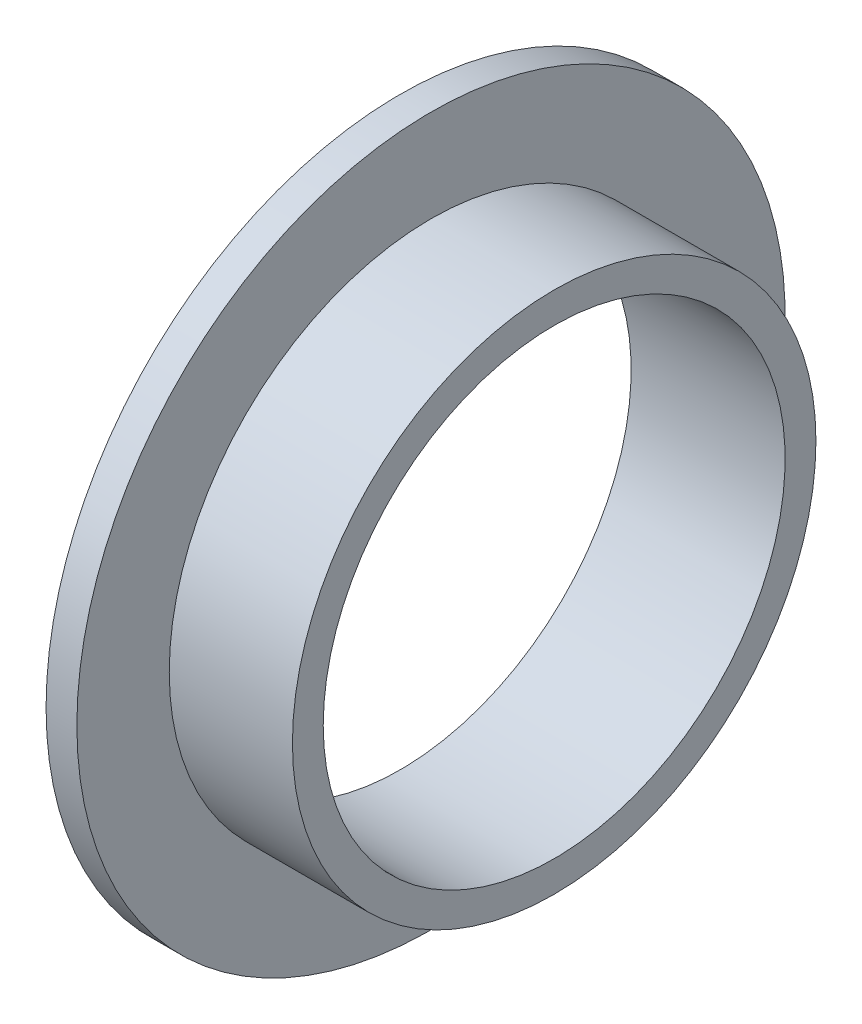
ISO-10303-21;
HEADER;
FILE_DESCRIPTION(('STEP AP214'),'2;1');
FILE_NAME('part.step','',(''),(''),'','','');
FILE_SCHEMA(('AUTOMOTIVE_DESIGN { 1 0 10303 214 1 1 1 1 }'));
ENDSEC;
DATA;
#1=APPLICATION_CONTEXT('core data for automotive mechanical design processes');
#2=APPLICATION_PROTOCOL_DEFINITION('international standard','automotive_design',2000,#1);
#3=PRODUCT_CONTEXT('',#1,'mechanical');
#4=PRODUCT('Part','Part','',(#3));
#5=PRODUCT_RELATED_PRODUCT_CATEGORY('part','',(#4));
#6=PRODUCT_DEFINITION_FORMATION('','',#4);
#7=PRODUCT_DEFINITION_CONTEXT('part definition',#1,'design');
#8=PRODUCT_DEFINITION('design','',#6,#7);
#9=PRODUCT_DEFINITION_SHAPE('','',#8);
#10=(LENGTH_UNIT() NAMED_UNIT(*) SI_UNIT(.MILLI.,.METRE.));
#11=(NAMED_UNIT(*) PLANE_ANGLE_UNIT() SI_UNIT($,.RADIAN.));
#12=(NAMED_UNIT(*) SI_UNIT($,.STERADIAN.) SOLID_ANGLE_UNIT());
#13=UNCERTAINTY_MEASURE_WITH_UNIT(LENGTH_MEASURE(1.E-05),#10,'distance_accuracy_value','');
#14=(GEOMETRIC_REPRESENTATION_CONTEXT(3) GLOBAL_UNCERTAINTY_ASSIGNED_CONTEXT((#13)) GLOBAL_UNIT_ASSIGNED_CONTEXT((#10,
#11,#12)) REPRESENTATION_CONTEXT('',''));
#15=CARTESIAN_POINT('',(0.,0.,0.));
#16=DIRECTION('',(0.,0.,1.));
#17=DIRECTION('',(1.,0.,0.));
#18=AXIS2_PLACEMENT_3D('',#15,#16,#17);
#19=CARTESIAN_POINT('',(-1000.,0.,0.));
#20=DIRECTION('',(-1.,0.,0.));
#21=DIRECTION('',(0.,0.,1.));
#22=AXIS2_PLACEMENT_3D('',#19,#20,#21);
#23=CYLINDRICAL_SURFACE('',#22,8.5);
#24=CARTESIAN_POINT('',(0.99999999999989,0.,0.));
#25=DIRECTION('',(-1.,0.,0.));
#26=DIRECTION('',(0.,0.,1.));
#27=AXIS2_PLACEMENT_3D('',#24,#25,#26);
#28=CIRCLE('',#27,8.5);
#29=CARTESIAN_POINT('',(0.99999999999989,0.,8.5));
#30=VERTEX_POINT('',#29);
#31=EDGE_CURVE('E35',#30,#30,#28,.F.);
#32=ORIENTED_EDGE('',*,*,#31,.T.);
#33=EDGE_LOOP('',(#32));
#34=FACE_BOUND('',#33,.T.);
#35=CARTESIAN_POINT('',(4.99999999999989,0.,0.));
#36=DIRECTION('',(-1.,0.,0.));
#37=DIRECTION('',(0.,0.,1.));
#38=AXIS2_PLACEMENT_3D('',#35,#36,#37);
#39=CIRCLE('',#38,8.5);
#40=CARTESIAN_POINT('',(4.99999999999989,0.,8.5));
#41=VERTEX_POINT('',#40);
#42=EDGE_CURVE('E19',#41,#41,#39,.T.);
#43=ORIENTED_EDGE('',*,*,#42,.T.);
#44=EDGE_LOOP('',(#43));
#45=FACE_BOUND('',#44,.T.);
#46=ADVANCED_FACE('F16',(#34,#45),#23,.T.);
#47=CARTESIAN_POINT('',(5.,7.5,0.));
#48=DIRECTION('',(-1.,0.,0.));
#49=DIRECTION('',(0.,0.,1.));
#50=AXIS2_PLACEMENT_3D('',#47,#48,#49);
#51=PLANE('',#50);
#52=CARTESIAN_POINT('',(4.99999999999989,0.,0.));
#53=DIRECTION('',(-1.,0.,0.));
#54=DIRECTION('',(0.,0.,1.));
#55=AXIS2_PLACEMENT_3D('',#52,#53,#54);
#56=CIRCLE('',#55,7.5);
#57=CARTESIAN_POINT('',(4.99999999999989,0.,7.5));
#58=VERTEX_POINT('',#57);
#59=EDGE_CURVE('E33',#58,#58,#56,.T.);
#60=ORIENTED_EDGE('',*,*,#59,.T.);
#61=EDGE_LOOP('',(#60));
#62=FACE_BOUND('',#61,.T.);
#63=ORIENTED_EDGE('',*,*,#42,.F.);
#64=EDGE_LOOP('',(#63));
#65=FACE_BOUND('',#64,.T.);
#66=ADVANCED_FACE('F43',(#62,#65),#51,.F.);
#67=CARTESIAN_POINT('',(1.,8.5,0.));
#68=DIRECTION('',(-1.,0.,0.));
#69=DIRECTION('',(0.,0.,1.));
#70=AXIS2_PLACEMENT_3D('',#67,#68,#69);
#71=PLANE('',#70);
#72=ORIENTED_EDGE('',*,*,#31,.F.);
#73=EDGE_LOOP('',(#72));
#74=FACE_BOUND('',#73,.T.);
#75=CARTESIAN_POINT('',(0.99999999999989,0.,0.));
#76=DIRECTION('',(-1.,0.,0.));
#77=DIRECTION('',(0.,0.,1.));
#78=AXIS2_PLACEMENT_3D('',#75,#76,#77);
#79=CIRCLE('',#78,11.5);
#80=CARTESIAN_POINT('',(0.99999999999989,0.,11.5));
#81=VERTEX_POINT('',#80);
#82=EDGE_CURVE('E28',#81,#81,#79,.T.);
#83=ORIENTED_EDGE('',*,*,#82,.F.);
#84=EDGE_LOOP('',(#83));
#85=FACE_BOUND('',#84,.T.);
#86=ADVANCED_FACE('F45',(#74,#85),#71,.F.);
#87=CARTESIAN_POINT('',(-1000.,0.,0.));
#88=DIRECTION('',(-1.,0.,0.));
#89=DIRECTION('',(0.,0.,1.));
#90=AXIS2_PLACEMENT_3D('',#87,#88,#89);
#91=CYLINDRICAL_SURFACE('',#90,7.5);
#92=ORIENTED_EDGE('',*,*,#59,.F.);
#93=EDGE_LOOP('',(#92));
#94=FACE_BOUND('',#93,.T.);
#95=CARTESIAN_POINT('',(0.,0.,0.));
#96=DIRECTION('',(-1.,0.,0.));
#97=DIRECTION('',(0.,0.,1.));
#98=AXIS2_PLACEMENT_3D('',#95,#96,#97);
#99=CIRCLE('',#98,7.5);
#100=CARTESIAN_POINT('',(0.,0.,7.5));
#101=VERTEX_POINT('',#100);
#102=EDGE_CURVE('E23',#101,#101,#99,.T.);
#103=ORIENTED_EDGE('',*,*,#102,.T.);
#104=EDGE_LOOP('',(#103));
#105=FACE_BOUND('',#104,.T.);
#106=ADVANCED_FACE('F51',(#94,#105),#91,.F.);
#107=CARTESIAN_POINT('',(-1000.,0.,0.));
#108=DIRECTION('',(-1.,0.,0.));
#109=DIRECTION('',(0.,0.,1.));
#110=AXIS2_PLACEMENT_3D('',#107,#108,#109);
#111=CYLINDRICAL_SURFACE('',#110,11.5);
#112=CARTESIAN_POINT('',(0.,0.,0.));
#113=DIRECTION('',(-1.,0.,0.));
#114=DIRECTION('',(0.,0.,1.));
#115=AXIS2_PLACEMENT_3D('',#112,#113,#114);
#116=CIRCLE('',#115,11.5);
#117=CARTESIAN_POINT('',(0.,0.,11.5));
#118=VERTEX_POINT('',#117);
#119=EDGE_CURVE('E10',#118,#118,#116,.F.);
#120=ORIENTED_EDGE('',*,*,#119,.T.);
#121=EDGE_LOOP('',(#120));
#122=FACE_BOUND('',#121,.T.);
#123=ORIENTED_EDGE('',*,*,#82,.T.);
#124=EDGE_LOOP('',(#123));
#125=FACE_BOUND('',#124,.T.);
#126=ADVANCED_FACE('F56',(#122,#125),#111,.T.);
#127=CARTESIAN_POINT('',(0.,11.5,0.));
#128=DIRECTION('',(1.,0.,0.));
#129=DIRECTION('',(0.,0.,-1.));
#130=AXIS2_PLACEMENT_3D('',#127,#128,#129);
#131=PLANE('',#130);
#132=ORIENTED_EDGE('',*,*,#119,.F.);
#133=EDGE_LOOP('',(#132));
#134=FACE_BOUND('',#133,.T.);
#135=ORIENTED_EDGE('',*,*,#102,.F.);
#136=EDGE_LOOP('',(#135));
#137=FACE_BOUND('',#136,.T.);
#138=ADVANCED_FACE('F54',(#134,#137),#131,.F.);
#139=CLOSED_SHELL('',(#46,#66,#86,#106,#126,#138));
#140=MANIFOLD_SOLID_BREP('B1',#139);
#141=ADVANCED_BREP_SHAPE_REPRESENTATION('',(#18,#140),#14);
#142=SHAPE_DEFINITION_REPRESENTATION(#9,#141);
ENDSEC;
END-ISO-10303-21;
